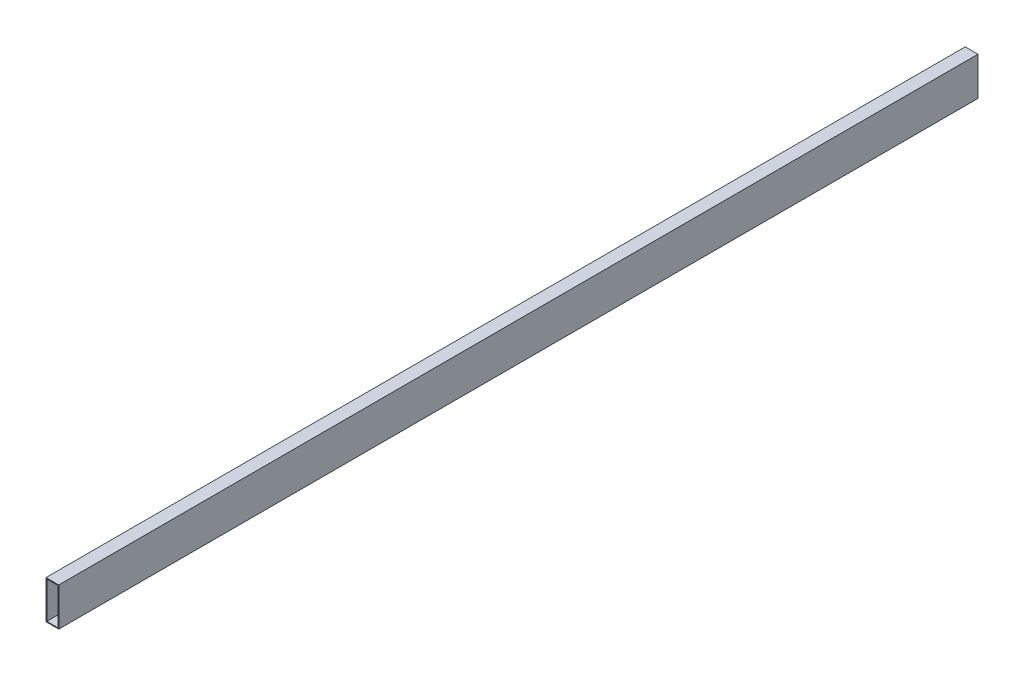
ISO-10303-21;
HEADER;
FILE_DESCRIPTION(('STEP AP214'),'2;1');
FILE_NAME('part.step','',(''),(''),'','','');
FILE_SCHEMA(('AUTOMOTIVE_DESIGN { 1 0 10303 214 1 1 1 1 }'));
ENDSEC;
DATA;
#1=APPLICATION_CONTEXT('core data for automotive mechanical design processes');
#2=APPLICATION_PROTOCOL_DEFINITION('international standard','automotive_design',2000,#1);
#3=PRODUCT_CONTEXT('',#1,'mechanical');
#4=PRODUCT('Part','Part','',(#3));
#5=PRODUCT_RELATED_PRODUCT_CATEGORY('part','',(#4));
#6=PRODUCT_DEFINITION_FORMATION('','',#4);
#7=PRODUCT_DEFINITION_CONTEXT('part definition',#1,'design');
#8=PRODUCT_DEFINITION('design','',#6,#7);
#9=PRODUCT_DEFINITION_SHAPE('','',#8);
#10=(LENGTH_UNIT() NAMED_UNIT(*) SI_UNIT(.MILLI.,.METRE.));
#11=(NAMED_UNIT(*) PLANE_ANGLE_UNIT() SI_UNIT($,.RADIAN.));
#12=(NAMED_UNIT(*) SI_UNIT($,.STERADIAN.) SOLID_ANGLE_UNIT());
#13=UNCERTAINTY_MEASURE_WITH_UNIT(LENGTH_MEASURE(1.E-05),#10,'distance_accuracy_value','');
#14=(GEOMETRIC_REPRESENTATION_CONTEXT(3) GLOBAL_UNCERTAINTY_ASSIGNED_CONTEXT((#13)) GLOBAL_UNIT_ASSIGNED_CONTEXT((#10,
#11,#12)) REPRESENTATION_CONTEXT('',''));
#15=CARTESIAN_POINT('',(0.,0.,0.));
#16=DIRECTION('',(0.,0.,1.));
#17=DIRECTION('',(1.,0.,0.));
#18=AXIS2_PLACEMENT_3D('',#15,#16,#17);
#19=CARTESIAN_POINT('',(0.,152.4,3657.6));
#20=DIRECTION('',(0.,0.,-1.));
#21=DIRECTION('',(-1.,0.,0.));
#22=AXIS2_PLACEMENT_3D('',#19,#20,#21);
#23=PLANE('',#22);
#24=DIRECTION('',(0.,-1.,0.));
#25=VECTOR('',#24,1.);
#26=CARTESIAN_POINT('',(0.,0.,3657.6));
#27=LINE('',#26,#25);
#28=CARTESIAN_POINT('',(0.,152.4,3657.6));
#29=VERTEX_POINT('',#28);
#30=CARTESIAN_POINT('',(0.,0.,3657.6));
#31=VERTEX_POINT('',#30);
#32=EDGE_CURVE('E132',#29,#31,#27,.T.);
#33=ORIENTED_EDGE('',*,*,#32,.T.);
#34=DIRECTION('',(1.,0.,0.));
#35=VECTOR('',#34,1.);
#36=CARTESIAN_POINT('',(0.,0.,3657.6));
#37=LINE('',#36,#35);
#38=CARTESIAN_POINT('',(50.8,0.,3657.6));
#39=VERTEX_POINT('',#38);
#40=EDGE_CURVE('E135',#31,#39,#37,.T.);
#41=ORIENTED_EDGE('',*,*,#40,.T.);
#42=DIRECTION('',(0.,1.,0.));
#43=VECTOR('',#42,1.);
#44=CARTESIAN_POINT('',(50.8,0.,3657.6));
#45=LINE('',#44,#43);
#46=CARTESIAN_POINT('',(50.8,152.4,3657.6));
#47=VERTEX_POINT('',#46);
#48=EDGE_CURVE('E138',#39,#47,#45,.T.);
#49=ORIENTED_EDGE('',*,*,#48,.T.);
#50=DIRECTION('',(-1.,0.,0.));
#51=VECTOR('',#50,1.);
#52=CARTESIAN_POINT('',(0.,152.4,3657.6));
#53=LINE('',#52,#51);
#54=EDGE_CURVE('E140',#47,#29,#53,.T.);
#55=ORIENTED_EDGE('',*,*,#54,.T.);
#56=EDGE_LOOP('',(#33,#41,#49,#55));
#57=FACE_BOUND('',#56,.T.);
#58=DIRECTION('',(0.,-1.,0.));
#59=VECTOR('',#58,1.);
#60=CARTESIAN_POINT('',(3.17499999999996,152.4,3657.6));
#61=LINE('',#60,#59);
#62=CARTESIAN_POINT('',(3.17499999999996,149.225,3657.6));
#63=VERTEX_POINT('',#62);
#64=CARTESIAN_POINT('',(3.175,3.175,3657.6));
#65=VERTEX_POINT('',#64);
#66=EDGE_CURVE('E120',#63,#65,#61,.T.);
#67=ORIENTED_EDGE('',*,*,#66,.F.);
#68=DIRECTION('',(-1.,0.,0.));
#69=VECTOR('',#68,1.);
#70=CARTESIAN_POINT('',(0.,149.225,3657.6));
#71=LINE('',#70,#69);
#72=CARTESIAN_POINT('',(47.625,149.225,3657.6));
#73=VERTEX_POINT('',#72);
#74=EDGE_CURVE('E105',#73,#63,#71,.T.);
#75=ORIENTED_EDGE('',*,*,#74,.F.);
#76=DIRECTION('',(0.,1.,0.));
#77=VECTOR('',#76,1.);
#78=CARTESIAN_POINT('',(47.625,152.4,3657.6));
#79=LINE('',#78,#77);
#80=CARTESIAN_POINT('',(47.625,3.175,3657.6));
#81=VERTEX_POINT('',#80);
#82=EDGE_CURVE('E129',#81,#73,#79,.T.);
#83=ORIENTED_EDGE('',*,*,#82,.F.);
#84=DIRECTION('',(1.,0.,0.));
#85=VECTOR('',#84,1.);
#86=CARTESIAN_POINT('',(0.,3.17500000000001,3657.6));
#87=LINE('',#86,#85);
#88=EDGE_CURVE('E122',#65,#81,#87,.T.);
#89=ORIENTED_EDGE('',*,*,#88,.F.);
#90=EDGE_LOOP('',(#67,#75,#83,#89));
#91=FACE_BOUND('',#90,.T.);
#92=ADVANCED_FACE('F35',(#57,#91),#23,.F.);
#93=CARTESIAN_POINT('',(0.,152.4,0.));
#94=DIRECTION('',(0.,0.,-1.));
#95=DIRECTION('',(-1.,0.,0.));
#96=AXIS2_PLACEMENT_3D('',#93,#94,#95);
#97=PLANE('',#96);
#98=DIRECTION('',(0.,-1.,0.));
#99=VECTOR('',#98,1.);
#100=CARTESIAN_POINT('',(0.,0.,0.));
#101=LINE('',#100,#99);
#102=CARTESIAN_POINT('',(0.,152.4,0.));
#103=VERTEX_POINT('',#102);
#104=CARTESIAN_POINT('',(0.,0.,0.));
#105=VERTEX_POINT('',#104);
#106=EDGE_CURVE('E143',#103,#105,#101,.T.);
#107=ORIENTED_EDGE('',*,*,#106,.F.);
#108=DIRECTION('',(-1.,0.,0.));
#109=VECTOR('',#108,1.);
#110=CARTESIAN_POINT('',(0.,152.4,0.));
#111=LINE('',#110,#109);
#112=CARTESIAN_POINT('',(50.8,152.4,0.));
#113=VERTEX_POINT('',#112);
#114=EDGE_CURVE('E136',#113,#103,#111,.T.);
#115=ORIENTED_EDGE('',*,*,#114,.F.);
#116=DIRECTION('',(0.,1.,0.));
#117=VECTOR('',#116,1.);
#118=CARTESIAN_POINT('',(50.8,0.,0.));
#119=LINE('',#118,#117);
#120=CARTESIAN_POINT('',(50.8,0.,0.));
#121=VERTEX_POINT('',#120);
#122=EDGE_CURVE('E148',#121,#113,#119,.T.);
#123=ORIENTED_EDGE('',*,*,#122,.F.);
#124=DIRECTION('',(1.,0.,0.));
#125=VECTOR('',#124,1.);
#126=CARTESIAN_POINT('',(0.,0.,0.));
#127=LINE('',#126,#125);
#128=EDGE_CURVE('E146',#105,#121,#127,.T.);
#129=ORIENTED_EDGE('',*,*,#128,.F.);
#130=EDGE_LOOP('',(#107,#115,#123,#129));
#131=FACE_BOUND('',#130,.T.);
#132=DIRECTION('',(-1.,0.,0.));
#133=VECTOR('',#132,1.);
#134=CARTESIAN_POINT('',(0.,149.225,0.));
#135=LINE('',#134,#133);
#136=CARTESIAN_POINT('',(47.625,149.225,0.));
#137=VERTEX_POINT('',#136);
#138=CARTESIAN_POINT('',(3.17499999999996,149.225,0.));
#139=VERTEX_POINT('',#138);
#140=EDGE_CURVE('E103',#137,#139,#135,.T.);
#141=ORIENTED_EDGE('',*,*,#140,.T.);
#142=DIRECTION('',(0.,-1.,0.));
#143=VECTOR('',#142,1.);
#144=CARTESIAN_POINT('',(3.17499999999996,152.4,0.));
#145=LINE('',#144,#143);
#146=CARTESIAN_POINT('',(3.175,3.175,0.));
#147=VERTEX_POINT('',#146);
#148=EDGE_CURVE('E111',#139,#147,#145,.T.);
#149=ORIENTED_EDGE('',*,*,#148,.T.);
#150=DIRECTION('',(1.,0.,0.));
#151=VECTOR('',#150,1.);
#152=CARTESIAN_POINT('',(0.,3.17500000000001,0.));
#153=LINE('',#152,#151);
#154=CARTESIAN_POINT('',(47.625,3.175,0.));
#155=VERTEX_POINT('',#154);
#156=EDGE_CURVE('E117',#147,#155,#153,.T.);
#157=ORIENTED_EDGE('',*,*,#156,.T.);
#158=DIRECTION('',(0.,1.,0.));
#159=VECTOR('',#158,1.);
#160=CARTESIAN_POINT('',(47.625,152.4,0.));
#161=LINE('',#160,#159);
#162=EDGE_CURVE('E57',#155,#137,#161,.T.);
#163=ORIENTED_EDGE('',*,*,#162,.T.);
#164=EDGE_LOOP('',(#141,#149,#157,#163));
#165=FACE_BOUND('',#164,.T.);
#166=ADVANCED_FACE('F119',(#131,#165),#97,.T.);
#167=CARTESIAN_POINT('',(0.,0.,3657.6));
#168=DIRECTION('',(1.,0.,0.));
#169=DIRECTION('',(0.,1.,0.));
#170=AXIS2_PLACEMENT_3D('',#167,#168,#169);
#171=PLANE('',#170);
#172=ORIENTED_EDGE('',*,*,#106,.T.);
#173=DIRECTION('',(0.,0.,-1.));
#174=VECTOR('',#173,1.);
#175=CARTESIAN_POINT('',(0.,0.,3657.6));
#176=LINE('',#175,#174);
#177=EDGE_CURVE('E11',#31,#105,#176,.T.);
#178=ORIENTED_EDGE('',*,*,#177,.F.);
#179=ORIENTED_EDGE('',*,*,#32,.F.);
#180=DIRECTION('',(0.,0.,-1.));
#181=VECTOR('',#180,1.);
#182=CARTESIAN_POINT('',(0.,152.4,3657.6));
#183=LINE('',#182,#181);
#184=EDGE_CURVE('E142',#29,#103,#183,.T.);
#185=ORIENTED_EDGE('',*,*,#184,.T.);
#186=EDGE_LOOP('',(#172,#178,#179,#185));
#187=FACE_BOUND('',#186,.T.);
#188=ADVANCED_FACE('F37',(#187),#171,.F.);
#189=CARTESIAN_POINT('',(0.,0.,3657.6));
#190=DIRECTION('',(0.,1.,0.));
#191=DIRECTION('',(0.,0.,1.));
#192=AXIS2_PLACEMENT_3D('',#189,#190,#191);
#193=PLANE('',#192);
#194=ORIENTED_EDGE('',*,*,#128,.T.);
#195=DIRECTION('',(0.,0.,-1.));
#196=VECTOR('',#195,1.);
#197=CARTESIAN_POINT('',(50.8,0.,3657.6));
#198=LINE('',#197,#196);
#199=EDGE_CURVE('E43',#39,#121,#198,.T.);
#200=ORIENTED_EDGE('',*,*,#199,.F.);
#201=ORIENTED_EDGE('',*,*,#40,.F.);
#202=ORIENTED_EDGE('',*,*,#177,.T.);
#203=EDGE_LOOP('',(#194,#200,#201,#202));
#204=FACE_BOUND('',#203,.T.);
#205=ADVANCED_FACE('F175',(#204),#193,.F.);
#206=CARTESIAN_POINT('',(50.8,0.,3657.6));
#207=DIRECTION('',(-1.,0.,0.));
#208=DIRECTION('',(0.,0.,1.));
#209=AXIS2_PLACEMENT_3D('',#206,#207,#208);
#210=PLANE('',#209);
#211=ORIENTED_EDGE('',*,*,#122,.T.);
#212=DIRECTION('',(0.,0.,-1.));
#213=VECTOR('',#212,1.);
#214=CARTESIAN_POINT('',(50.8,152.4,3657.6));
#215=LINE('',#214,#213);
#216=EDGE_CURVE('E153',#47,#113,#215,.T.);
#217=ORIENTED_EDGE('',*,*,#216,.F.);
#218=ORIENTED_EDGE('',*,*,#48,.F.);
#219=ORIENTED_EDGE('',*,*,#199,.T.);
#220=EDGE_LOOP('',(#211,#217,#218,#219));
#221=FACE_BOUND('',#220,.T.);
#222=ADVANCED_FACE('F160',(#221),#210,.F.);
#223=CARTESIAN_POINT('',(0.,152.4,3657.6));
#224=DIRECTION('',(0.,-1.,0.));
#225=DIRECTION('',(0.,0.,-1.));
#226=AXIS2_PLACEMENT_3D('',#223,#224,#225);
#227=PLANE('',#226);
#228=ORIENTED_EDGE('',*,*,#114,.T.);
#229=ORIENTED_EDGE('',*,*,#184,.F.);
#230=ORIENTED_EDGE('',*,*,#54,.F.);
#231=ORIENTED_EDGE('',*,*,#216,.T.);
#232=EDGE_LOOP('',(#228,#229,#230,#231));
#233=FACE_BOUND('',#232,.T.);
#234=ADVANCED_FACE('F168',(#233),#227,.F.);
#235=CARTESIAN_POINT('',(3.175,0.,3657.6));
#236=DIRECTION('',(1.,0.,0.));
#237=DIRECTION('',(0.,1.,0.));
#238=AXIS2_PLACEMENT_3D('',#235,#236,#237);
#239=PLANE('',#238);
#240=ORIENTED_EDGE('',*,*,#148,.F.);
#241=DIRECTION('',(0.,0.,-1.));
#242=VECTOR('',#241,1.);
#243=CARTESIAN_POINT('',(3.17499999999996,149.225,3657.6));
#244=LINE('',#243,#242);
#245=EDGE_CURVE('E99',#63,#139,#244,.T.);
#246=ORIENTED_EDGE('',*,*,#245,.F.);
#247=ORIENTED_EDGE('',*,*,#66,.T.);
#248=DIRECTION('',(0.,0.,-1.));
#249=VECTOR('',#248,1.);
#250=CARTESIAN_POINT('',(3.175,3.175,3657.6));
#251=LINE('',#250,#249);
#252=EDGE_CURVE('E114',#65,#147,#251,.T.);
#253=ORIENTED_EDGE('',*,*,#252,.T.);
#254=EDGE_LOOP('',(#240,#246,#247,#253));
#255=FACE_BOUND('',#254,.T.);
#256=ADVANCED_FACE('F112',(#255),#239,.T.);
#257=CARTESIAN_POINT('',(0.,3.175,3657.6));
#258=DIRECTION('',(0.,1.,0.));
#259=DIRECTION('',(0.,0.,1.));
#260=AXIS2_PLACEMENT_3D('',#257,#258,#259);
#261=PLANE('',#260);
#262=ORIENTED_EDGE('',*,*,#156,.F.);
#263=ORIENTED_EDGE('',*,*,#252,.F.);
#264=ORIENTED_EDGE('',*,*,#88,.T.);
#265=DIRECTION('',(0.,0.,-1.));
#266=VECTOR('',#265,1.);
#267=CARTESIAN_POINT('',(47.625,3.175,3657.6));
#268=LINE('',#267,#266);
#269=EDGE_CURVE('E258',#81,#155,#268,.T.);
#270=ORIENTED_EDGE('',*,*,#269,.T.);
#271=EDGE_LOOP('',(#262,#263,#264,#270));
#272=FACE_BOUND('',#271,.T.);
#273=ADVANCED_FACE('F195',(#272),#261,.T.);
#274=CARTESIAN_POINT('',(47.625,0.,3657.6));
#275=DIRECTION('',(-1.,0.,0.));
#276=DIRECTION('',(0.,0.,1.));
#277=AXIS2_PLACEMENT_3D('',#274,#275,#276);
#278=PLANE('',#277);
#279=ORIENTED_EDGE('',*,*,#162,.F.);
#280=ORIENTED_EDGE('',*,*,#269,.F.);
#281=ORIENTED_EDGE('',*,*,#82,.T.);
#282=DIRECTION('',(0.,0.,-1.));
#283=VECTOR('',#282,1.);
#284=CARTESIAN_POINT('',(47.625,149.225,3657.6));
#285=LINE('',#284,#283);
#286=EDGE_CURVE('E50',#73,#137,#285,.T.);
#287=ORIENTED_EDGE('',*,*,#286,.T.);
#288=EDGE_LOOP('',(#279,#280,#281,#287));
#289=FACE_BOUND('',#288,.T.);
#290=ADVANCED_FACE('F200',(#289),#278,.T.);
#291=CARTESIAN_POINT('',(0.,149.225,3657.6));
#292=DIRECTION('',(0.,-1.,0.));
#293=DIRECTION('',(0.,0.,-1.));
#294=AXIS2_PLACEMENT_3D('',#291,#292,#293);
#295=PLANE('',#294);
#296=ORIENTED_EDGE('',*,*,#140,.F.);
#297=ORIENTED_EDGE('',*,*,#286,.F.);
#298=ORIENTED_EDGE('',*,*,#74,.T.);
#299=ORIENTED_EDGE('',*,*,#245,.T.);
#300=EDGE_LOOP('',(#296,#297,#298,#299));
#301=FACE_BOUND('',#300,.T.);
#302=ADVANCED_FACE('F101',(#301),#295,.T.);
#303=CLOSED_SHELL('',(#92,#166,#188,#205,#222,#234,#256,#273,#290,#302));
#304=MANIFOLD_SOLID_BREP('B2',#303);
#305=ADVANCED_BREP_SHAPE_REPRESENTATION('',(#18,#304),#14);
#306=SHAPE_DEFINITION_REPRESENTATION(#9,#305);
ENDSEC;
END-ISO-10303-21;
